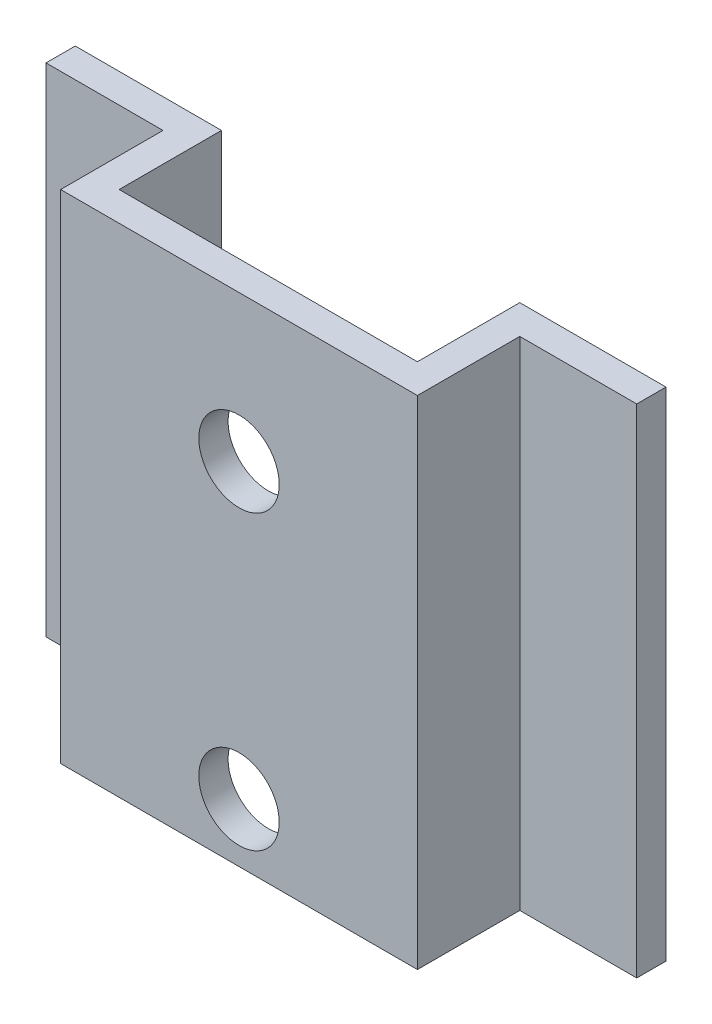
ISO-10303-21;
HEADER;
FILE_DESCRIPTION(('STEP AP214'),'2;1');
FILE_NAME('part.step','',(''),(''),'','','');
FILE_SCHEMA(('AUTOMOTIVE_DESIGN { 1 0 10303 214 1 1 1 1 }'));
ENDSEC;
DATA;
#1=APPLICATION_CONTEXT('core data for automotive mechanical design processes');
#2=APPLICATION_PROTOCOL_DEFINITION('international standard','automotive_design',2000,#1);
#3=PRODUCT_CONTEXT('',#1,'mechanical');
#4=PRODUCT('Part','Part','',(#3));
#5=PRODUCT_RELATED_PRODUCT_CATEGORY('part','',(#4));
#6=PRODUCT_DEFINITION_FORMATION('','',#4);
#7=PRODUCT_DEFINITION_CONTEXT('part definition',#1,'design');
#8=PRODUCT_DEFINITION('design','',#6,#7);
#9=PRODUCT_DEFINITION_SHAPE('','',#8);
#10=(LENGTH_UNIT() NAMED_UNIT(*) SI_UNIT(.MILLI.,.METRE.));
#11=(NAMED_UNIT(*) PLANE_ANGLE_UNIT() SI_UNIT($,.RADIAN.));
#12=(NAMED_UNIT(*) SI_UNIT($,.STERADIAN.) SOLID_ANGLE_UNIT());
#13=UNCERTAINTY_MEASURE_WITH_UNIT(LENGTH_MEASURE(1.E-05),#10,'distance_accuracy_value','');
#14=(GEOMETRIC_REPRESENTATION_CONTEXT(3) GLOBAL_UNCERTAINTY_ASSIGNED_CONTEXT((#13)) GLOBAL_UNIT_ASSIGNED_CONTEXT((#10,
#11,#12)) REPRESENTATION_CONTEXT('',''));
#15=CARTESIAN_POINT('',(0.,0.,0.));
#16=DIRECTION('',(0.,0.,1.));
#17=DIRECTION('',(1.,0.,0.));
#18=AXIS2_PLACEMENT_3D('',#15,#16,#17);
#19=CARTESIAN_POINT('',(0.,0.,2.));
#20=DIRECTION('',(0.,0.,1.));
#21=DIRECTION('',(1.,0.,0.));
#22=AXIS2_PLACEMENT_3D('',#19,#20,#21);
#23=PLANE('',#22);
#24=CARTESIAN_POINT('',(1.78676518025611E-13,52.0000000000006,2.));
#25=DIRECTION('',(0.,0.,-1.));
#26=DIRECTION('',(-1.,0.,0.));
#27=AXIS2_PLACEMENT_3D('',#24,#25,#26);
#28=CIRCLE('',#27,2.75);
#29=CARTESIAN_POINT('',(-2.74999999999982,52.0000000000006,2.));
#30=VERTEX_POINT('',#29);
#31=EDGE_CURVE('E167',#30,#30,#28,.T.);
#32=ORIENTED_EDGE('',*,*,#31,.T.);
#33=EDGE_LOOP('',(#32));
#34=FACE_BOUND('',#33,.T.);
#35=CARTESIAN_POINT('',(1.78676518025611E-13,32.0000000000006,2.));
#36=DIRECTION('',(0.,0.,-1.));
#37=DIRECTION('',(-1.,0.,0.));
#38=AXIS2_PLACEMENT_3D('',#35,#36,#37);
#39=CIRCLE('',#38,2.75);
#40=CARTESIAN_POINT('',(-2.74999999999982,32.0000000000006,2.));
#41=VERTEX_POINT('',#40);
#42=EDGE_CURVE('E279',#41,#41,#39,.T.);
#43=ORIENTED_EDGE('',*,*,#42,.T.);
#44=EDGE_LOOP('',(#43));
#45=FACE_BOUND('',#44,.T.);
#46=DIRECTION('',(0.,1.,0.));
#47=VECTOR('',#46,1.);
#48=CARTESIAN_POINT('',(12.2000000000002,28.0000000000007,2.));
#49=LINE('',#48,#47);
#50=CARTESIAN_POINT('',(12.2000000000002,28.0000000000007,2.));
#51=VERTEX_POINT('',#50);
#52=CARTESIAN_POINT('',(12.2000000000002,62.0000000000007,2.));
#53=VERTEX_POINT('',#52);
#54=EDGE_CURVE('E131',#51,#53,#49,.T.);
#55=ORIENTED_EDGE('',*,*,#54,.T.);
#56=DIRECTION('',(-1.,0.,0.));
#57=VECTOR('',#56,1.);
#58=CARTESIAN_POINT('',(10.0000000000002,62.0000000000007,2.));
#59=LINE('',#58,#57);
#60=CARTESIAN_POINT('',(-12.1999999999998,62.0000000000007,2.));
#61=VERTEX_POINT('',#60);
#62=EDGE_CURVE('E44',#53,#61,#59,.T.);
#63=ORIENTED_EDGE('',*,*,#62,.T.);
#64=DIRECTION('',(0.,1.,0.));
#65=VECTOR('',#64,1.);
#66=CARTESIAN_POINT('',(-12.1999999999998,28.0000000000007,2.));
#67=LINE('',#66,#65);
#68=CARTESIAN_POINT('',(-12.1999999999998,28.0000000000007,2.));
#69=VERTEX_POINT('',#68);
#70=EDGE_CURVE('E151',#69,#61,#67,.T.);
#71=ORIENTED_EDGE('',*,*,#70,.F.);
#72=DIRECTION('',(1.,0.,0.));
#73=VECTOR('',#72,1.);
#74=CARTESIAN_POINT('',(-9.99999999999982,28.0000000000006,2.));
#75=LINE('',#74,#73);
#76=EDGE_CURVE('E11',#69,#51,#75,.T.);
#77=ORIENTED_EDGE('',*,*,#76,.T.);
#78=EDGE_LOOP('',(#55,#63,#71,#77));
#79=FACE_BOUND('',#78,.T.);
#80=ADVANCED_FACE('F35',(#34,#45,#79),#23,.T.);
#81=CARTESIAN_POINT('',(0.,0.,0.));
#82=DIRECTION('',(0.,0.,1.));
#83=DIRECTION('',(1.,0.,0.));
#84=AXIS2_PLACEMENT_3D('',#81,#82,#83);
#85=PLANE('',#84);
#86=CARTESIAN_POINT('',(1.78676518025611E-13,52.0000000000006,0.));
#87=DIRECTION('',(0.,0.,-1.));
#88=DIRECTION('',(-1.,0.,0.));
#89=AXIS2_PLACEMENT_3D('',#86,#87,#88);
#90=CIRCLE('',#89,2.75);
#91=CARTESIAN_POINT('',(-2.74999999999982,52.0000000000006,0.));
#92=VERTEX_POINT('',#91);
#93=EDGE_CURVE('E281',#92,#92,#90,.T.);
#94=ORIENTED_EDGE('',*,*,#93,.F.);
#95=EDGE_LOOP('',(#94));
#96=FACE_BOUND('',#95,.T.);
#97=CARTESIAN_POINT('',(1.78676518025611E-13,32.0000000000006,0.));
#98=DIRECTION('',(0.,0.,-1.));
#99=DIRECTION('',(-1.,0.,0.));
#100=AXIS2_PLACEMENT_3D('',#97,#98,#99);
#101=CIRCLE('',#100,2.75);
#102=CARTESIAN_POINT('',(-2.74999999999982,32.0000000000006,0.));
#103=VERTEX_POINT('',#102);
#104=EDGE_CURVE('E148',#103,#103,#101,.T.);
#105=ORIENTED_EDGE('',*,*,#104,.F.);
#106=EDGE_LOOP('',(#105));
#107=FACE_BOUND('',#106,.T.);
#108=DIRECTION('',(-1.,0.,0.));
#109=VECTOR('',#108,1.);
#110=CARTESIAN_POINT('',(10.0000000000002,62.0000000000007,0.));
#111=LINE('',#110,#109);
#112=CARTESIAN_POINT('',(10.2000000000002,62.0000000000007,0.));
#113=VERTEX_POINT('',#112);
#114=CARTESIAN_POINT('',(-10.1999999999998,62.0000000000007,0.));
#115=VERTEX_POINT('',#114);
#116=EDGE_CURVE('E217',#113,#115,#111,.T.);
#117=ORIENTED_EDGE('',*,*,#116,.F.);
#118=DIRECTION('',(0.,1.,0.));
#119=VECTOR('',#118,1.);
#120=CARTESIAN_POINT('',(10.2000000000002,7.50219523949032,0.));
#121=LINE('',#120,#119);
#122=CARTESIAN_POINT('',(10.2000000000002,28.0000000000007,0.));
#123=VERTEX_POINT('',#122);
#124=EDGE_CURVE('E214',#123,#113,#121,.T.);
#125=ORIENTED_EDGE('',*,*,#124,.F.);
#126=DIRECTION('',(1.,0.,0.));
#127=VECTOR('',#126,1.);
#128=CARTESIAN_POINT('',(-9.99999999999982,28.0000000000006,0.));
#129=LINE('',#128,#127);
#130=CARTESIAN_POINT('',(-10.1999999999998,28.0000000000007,0.));
#131=VERTEX_POINT('',#130);
#132=EDGE_CURVE('E39',#131,#123,#129,.T.);
#133=ORIENTED_EDGE('',*,*,#132,.F.);
#134=DIRECTION('',(0.,1.,0.));
#135=VECTOR('',#134,1.);
#136=CARTESIAN_POINT('',(-10.1999999999998,7.50219523949032,0.));
#137=LINE('',#136,#135);
#138=EDGE_CURVE('E206',#131,#115,#137,.T.);
#139=ORIENTED_EDGE('',*,*,#138,.T.);
#140=EDGE_LOOP('',(#117,#125,#133,#139));
#141=FACE_BOUND('',#140,.T.);
#142=ADVANCED_FACE('F229',(#96,#107,#141),#85,.F.);
#143=CARTESIAN_POINT('',(10.0000000000002,62.0000000000007,2.));
#144=DIRECTION('',(0.,-1.,0.));
#145=DIRECTION('',(0.,0.,-1.));
#146=AXIS2_PLACEMENT_3D('',#143,#144,#145);
#147=PLANE('',#146);
#148=DIRECTION('',(0.,0.,1.));
#149=VECTOR('',#148,1.);
#150=CARTESIAN_POINT('',(12.2000000000002,62.0000000000007,0.));
#151=LINE('',#150,#149);
#152=CARTESIAN_POINT('',(12.2000000000002,62.0000000000007,-5.00000000000001));
#153=VERTEX_POINT('',#152);
#154=EDGE_CURVE('E144',#153,#53,#151,.T.);
#155=ORIENTED_EDGE('',*,*,#154,.F.);
#156=DIRECTION('',(-1.,0.,0.));
#157=VECTOR('',#156,1.);
#158=CARTESIAN_POINT('',(0.,62.0000000000007,-5.00000000000001));
#159=LINE('',#158,#157);
#160=CARTESIAN_POINT('',(20.2000000000002,62.0000000000007,-5.00000000000001));
#161=VERTEX_POINT('',#160);
#162=EDGE_CURVE('E128',#161,#153,#159,.T.);
#163=ORIENTED_EDGE('',*,*,#162,.F.);
#164=DIRECTION('',(0.,0.,-1.));
#165=VECTOR('',#164,1.);
#166=CARTESIAN_POINT('',(20.2000000000002,62.0000000000007,2.));
#167=LINE('',#166,#165);
#168=CARTESIAN_POINT('',(20.2000000000002,62.0000000000007,-7.00000000000001));
#169=VERTEX_POINT('',#168);
#170=EDGE_CURVE('E176',#161,#169,#167,.T.);
#171=ORIENTED_EDGE('',*,*,#170,.T.);
#172=DIRECTION('',(1.,0.,0.));
#173=VECTOR('',#172,1.);
#174=CARTESIAN_POINT('',(10.2000000000002,62.0000000000007,-7.00000000000001));
#175=LINE('',#174,#173);
#176=CARTESIAN_POINT('',(10.2000000000002,62.0000000000007,-7.00000000000001));
#177=VERTEX_POINT('',#176);
#178=EDGE_CURVE('E177',#177,#169,#175,.T.);
#179=ORIENTED_EDGE('',*,*,#178,.F.);
#180=DIRECTION('',(0.,0.,-1.));
#181=VECTOR('',#180,1.);
#182=CARTESIAN_POINT('',(10.2000000000002,62.0000000000007,2.));
#183=LINE('',#182,#181);
#184=EDGE_CURVE('E185',#113,#177,#183,.T.);
#185=ORIENTED_EDGE('',*,*,#184,.F.);
#186=ORIENTED_EDGE('',*,*,#116,.T.);
#187=DIRECTION('',(0.,0.,-1.));
#188=VECTOR('',#187,1.);
#189=CARTESIAN_POINT('',(-10.1999999999998,62.0000000000007,2.));
#190=LINE('',#189,#188);
#191=CARTESIAN_POINT('',(-10.1999999999998,62.0000000000007,-7.00000000000001));
#192=VERTEX_POINT('',#191);
#193=EDGE_CURVE('E209',#115,#192,#190,.T.);
#194=ORIENTED_EDGE('',*,*,#193,.T.);
#195=DIRECTION('',(1.,0.,0.));
#196=VECTOR('',#195,1.);
#197=CARTESIAN_POINT('',(-20.1999999999998,62.0000000000007,-7.00000000000001));
#198=LINE('',#197,#196);
#199=CARTESIAN_POINT('',(-20.1999999999998,62.0000000000007,-7.00000000000001));
#200=VERTEX_POINT('',#199);
#201=EDGE_CURVE('E192',#200,#192,#198,.T.);
#202=ORIENTED_EDGE('',*,*,#201,.F.);
#203=DIRECTION('',(0.,0.,-1.));
#204=VECTOR('',#203,1.);
#205=CARTESIAN_POINT('',(-20.1999999999998,62.0000000000007,2.));
#206=LINE('',#205,#204);
#207=CARTESIAN_POINT('',(-20.1999999999998,62.0000000000007,-5.00000000000001));
#208=VERTEX_POINT('',#207);
#209=EDGE_CURVE('E195',#208,#200,#206,.T.);
#210=ORIENTED_EDGE('',*,*,#209,.F.);
#211=DIRECTION('',(-1.,0.,0.));
#212=VECTOR('',#211,1.);
#213=CARTESIAN_POINT('',(0.,62.0000000000007,-5.00000000000001));
#214=LINE('',#213,#212);
#215=CARTESIAN_POINT('',(-12.1999999999998,62.0000000000007,-5.00000000000001));
#216=VERTEX_POINT('',#215);
#217=EDGE_CURVE('E52',#216,#208,#214,.T.);
#218=ORIENTED_EDGE('',*,*,#217,.F.);
#219=DIRECTION('',(0.,0.,-1.));
#220=VECTOR('',#219,1.);
#221=CARTESIAN_POINT('',(-12.1999999999998,62.0000000000007,0.));
#222=LINE('',#221,#220);
#223=EDGE_CURVE('E164',#61,#216,#222,.T.);
#224=ORIENTED_EDGE('',*,*,#223,.F.);
#225=ORIENTED_EDGE('',*,*,#62,.F.);
#226=EDGE_LOOP('',(#155,#163,#171,#179,#185,#186,#194,#202,#210,#218,#224,#225));
#227=FACE_BOUND('',#226,.T.);
#228=ADVANCED_FACE('F37',(#227),#147,.F.);
#229=CARTESIAN_POINT('',(-9.99999999999982,28.0000000000006,2.));
#230=DIRECTION('',(0.,1.,0.));
#231=DIRECTION('',(0.,0.,1.));
#232=AXIS2_PLACEMENT_3D('',#229,#230,#231);
#233=PLANE('',#232);
#234=DIRECTION('',(0.,0.,-1.));
#235=VECTOR('',#234,1.);
#236=CARTESIAN_POINT('',(20.2000000000002,28.0000000000007,2.));
#237=LINE('',#236,#235);
#238=CARTESIAN_POINT('',(20.2000000000002,28.0000000000007,-5.00000000000001));
#239=VERTEX_POINT('',#238);
#240=CARTESIAN_POINT('',(20.2000000000002,28.0000000000007,-7.00000000000001));
#241=VERTEX_POINT('',#240);
#242=EDGE_CURVE('E143',#239,#241,#237,.T.);
#243=ORIENTED_EDGE('',*,*,#242,.F.);
#244=DIRECTION('',(-1.,0.,0.));
#245=VECTOR('',#244,1.);
#246=CARTESIAN_POINT('',(0.,28.0000000000007,-5.00000000000001));
#247=LINE('',#246,#245);
#248=CARTESIAN_POINT('',(12.2000000000002,28.0000000000007,-5.00000000000001));
#249=VERTEX_POINT('',#248);
#250=EDGE_CURVE('E60',#239,#249,#247,.T.);
#251=ORIENTED_EDGE('',*,*,#250,.T.);
#252=DIRECTION('',(0.,0.,1.));
#253=VECTOR('',#252,1.);
#254=CARTESIAN_POINT('',(12.2000000000002,28.0000000000007,0.));
#255=LINE('',#254,#253);
#256=EDGE_CURVE('E132',#249,#51,#255,.T.);
#257=ORIENTED_EDGE('',*,*,#256,.T.);
#258=ORIENTED_EDGE('',*,*,#76,.F.);
#259=DIRECTION('',(0.,0.,-1.));
#260=VECTOR('',#259,1.);
#261=CARTESIAN_POINT('',(-12.1999999999998,28.0000000000007,0.));
#262=LINE('',#261,#260);
#263=CARTESIAN_POINT('',(-12.1999999999998,28.0000000000007,-5.00000000000001));
#264=VERTEX_POINT('',#263);
#265=EDGE_CURVE('E157',#69,#264,#262,.T.);
#266=ORIENTED_EDGE('',*,*,#265,.T.);
#267=DIRECTION('',(-1.,0.,0.));
#268=VECTOR('',#267,1.);
#269=CARTESIAN_POINT('',(0.,28.0000000000007,-5.00000000000001));
#270=LINE('',#269,#268);
#271=CARTESIAN_POINT('',(-20.1999999999998,28.0000000000007,-5.00000000000001));
#272=VERTEX_POINT('',#271);
#273=EDGE_CURVE('E160',#264,#272,#270,.T.);
#274=ORIENTED_EDGE('',*,*,#273,.T.);
#275=DIRECTION('',(0.,0.,-1.));
#276=VECTOR('',#275,1.);
#277=CARTESIAN_POINT('',(-20.1999999999998,28.0000000000007,2.));
#278=LINE('',#277,#276);
#279=CARTESIAN_POINT('',(-20.1999999999998,28.0000000000007,-7.00000000000001));
#280=VERTEX_POINT('',#279);
#281=EDGE_CURVE('E204',#272,#280,#278,.T.);
#282=ORIENTED_EDGE('',*,*,#281,.T.);
#283=DIRECTION('',(-1.,0.,0.));
#284=VECTOR('',#283,1.);
#285=CARTESIAN_POINT('',(-10.1999999999998,28.0000000000007,-7.00000000000001));
#286=LINE('',#285,#284);
#287=CARTESIAN_POINT('',(-10.1999999999998,28.0000000000007,-7.00000000000001));
#288=VERTEX_POINT('',#287);
#289=EDGE_CURVE('E199',#288,#280,#286,.T.);
#290=ORIENTED_EDGE('',*,*,#289,.F.);
#291=DIRECTION('',(0.,0.,-1.));
#292=VECTOR('',#291,1.);
#293=CARTESIAN_POINT('',(-10.1999999999998,28.0000000000007,2.));
#294=LINE('',#293,#292);
#295=EDGE_CURVE('E207',#131,#288,#294,.T.);
#296=ORIENTED_EDGE('',*,*,#295,.F.);
#297=ORIENTED_EDGE('',*,*,#132,.T.);
#298=DIRECTION('',(0.,0.,-1.));
#299=VECTOR('',#298,1.);
#300=CARTESIAN_POINT('',(10.2000000000002,28.0000000000007,2.));
#301=LINE('',#300,#299);
#302=CARTESIAN_POINT('',(10.2000000000002,28.0000000000007,-7.00000000000001));
#303=VERTEX_POINT('',#302);
#304=EDGE_CURVE('E188',#123,#303,#301,.T.);
#305=ORIENTED_EDGE('',*,*,#304,.T.);
#306=DIRECTION('',(-1.,0.,0.));
#307=VECTOR('',#306,1.);
#308=CARTESIAN_POINT('',(20.2000000000002,28.0000000000007,-7.00000000000001));
#309=LINE('',#308,#307);
#310=EDGE_CURVE('E155',#241,#303,#309,.T.);
#311=ORIENTED_EDGE('',*,*,#310,.F.);
#312=EDGE_LOOP('',(#243,#251,#257,#258,#266,#274,#282,#290,#296,#297,#305,#311));
#313=FACE_BOUND('',#312,.T.);
#314=ADVANCED_FACE('F141',(#313),#233,.F.);
#315=CARTESIAN_POINT('',(-10.1999999999998,0.,2.));
#316=DIRECTION('',(1.,0.,0.));
#317=DIRECTION('',(0.,0.,-1.));
#318=AXIS2_PLACEMENT_3D('',#315,#316,#317);
#319=PLANE('',#318);
#320=ORIENTED_EDGE('',*,*,#138,.F.);
#321=ORIENTED_EDGE('',*,*,#295,.T.);
#322=DIRECTION('',(0.,-1.,0.));
#323=VECTOR('',#322,1.);
#324=CARTESIAN_POINT('',(-10.1999999999998,62.0000000000007,-7.00000000000001));
#325=LINE('',#324,#323);
#326=EDGE_CURVE('E187',#192,#288,#325,.T.);
#327=ORIENTED_EDGE('',*,*,#326,.F.);
#328=ORIENTED_EDGE('',*,*,#193,.F.);
#329=EDGE_LOOP('',(#320,#321,#327,#328));
#330=FACE_BOUND('',#329,.T.);
#331=ADVANCED_FACE('F257',(#330),#319,.T.);
#332=CARTESIAN_POINT('',(-20.1999999999998,0.,2.));
#333=DIRECTION('',(1.,0.,0.));
#334=DIRECTION('',(0.,1.,0.));
#335=AXIS2_PLACEMENT_3D('',#332,#333,#334);
#336=PLANE('',#335);
#337=ORIENTED_EDGE('',*,*,#281,.F.);
#338=DIRECTION('',(0.,1.,0.));
#339=VECTOR('',#338,1.);
#340=CARTESIAN_POINT('',(-20.1999999999998,28.0000000000007,-5.00000000000001));
#341=LINE('',#340,#339);
#342=EDGE_CURVE('E170',#272,#208,#341,.T.);
#343=ORIENTED_EDGE('',*,*,#342,.T.);
#344=ORIENTED_EDGE('',*,*,#209,.T.);
#345=DIRECTION('',(0.,1.,0.));
#346=VECTOR('',#345,1.);
#347=CARTESIAN_POINT('',(-20.1999999999998,28.0000000000007,-7.00000000000001));
#348=LINE('',#347,#346);
#349=EDGE_CURVE('E196',#280,#200,#348,.T.);
#350=ORIENTED_EDGE('',*,*,#349,.F.);
#351=EDGE_LOOP('',(#337,#343,#344,#350));
#352=FACE_BOUND('',#351,.T.);
#353=ADVANCED_FACE('F250',(#352),#336,.F.);
#354=CARTESIAN_POINT('',(-59.6940625505222,62.0000000000007,-7.00000000000001));
#355=DIRECTION('',(0.,0.,-1.));
#356=DIRECTION('',(-1.,0.,0.));
#357=AXIS2_PLACEMENT_3D('',#354,#355,#356);
#358=PLANE('',#357);
#359=ORIENTED_EDGE('',*,*,#326,.T.);
#360=ORIENTED_EDGE('',*,*,#289,.T.);
#361=ORIENTED_EDGE('',*,*,#349,.T.);
#362=ORIENTED_EDGE('',*,*,#201,.T.);
#363=EDGE_LOOP('',(#359,#360,#361,#362));
#364=FACE_BOUND('',#363,.T.);
#365=ADVANCED_FACE('F255',(#364),#358,.T.);
#366=CARTESIAN_POINT('',(10.2000000000002,0.,2.));
#367=DIRECTION('',(1.,0.,0.));
#368=DIRECTION('',(0.,0.,-1.));
#369=AXIS2_PLACEMENT_3D('',#366,#367,#368);
#370=PLANE('',#369);
#371=ORIENTED_EDGE('',*,*,#304,.F.);
#372=ORIENTED_EDGE('',*,*,#124,.T.);
#373=ORIENTED_EDGE('',*,*,#184,.T.);
#374=DIRECTION('',(0.,1.,0.));
#375=VECTOR('',#374,1.);
#376=CARTESIAN_POINT('',(10.2000000000002,28.0000000000007,-7.00000000000001));
#377=LINE('',#376,#375);
#378=EDGE_CURVE('E180',#303,#177,#377,.T.);
#379=ORIENTED_EDGE('',*,*,#378,.F.);
#380=EDGE_LOOP('',(#371,#372,#373,#379));
#381=FACE_BOUND('',#380,.T.);
#382=ADVANCED_FACE('F231',(#381),#370,.F.);
#383=CARTESIAN_POINT('',(20.2000000000002,0.,2.));
#384=DIRECTION('',(1.,0.,0.));
#385=DIRECTION('',(0.,1.,0.));
#386=AXIS2_PLACEMENT_3D('',#383,#384,#385);
#387=PLANE('',#386);
#388=DIRECTION('',(0.,1.,0.));
#389=VECTOR('',#388,1.);
#390=CARTESIAN_POINT('',(20.2000000000002,28.0000000000007,-5.00000000000001));
#391=LINE('',#390,#389);
#392=EDGE_CURVE('E153',#239,#161,#391,.T.);
#393=ORIENTED_EDGE('',*,*,#392,.F.);
#394=ORIENTED_EDGE('',*,*,#242,.T.);
#395=DIRECTION('',(0.,-1.,0.));
#396=VECTOR('',#395,1.);
#397=CARTESIAN_POINT('',(20.2000000000002,62.0000000000007,-7.00000000000001));
#398=LINE('',#397,#396);
#399=EDGE_CURVE('E173',#169,#241,#398,.T.);
#400=ORIENTED_EDGE('',*,*,#399,.F.);
#401=ORIENTED_EDGE('',*,*,#170,.F.);
#402=EDGE_LOOP('',(#393,#394,#400,#401));
#403=FACE_BOUND('',#402,.T.);
#404=ADVANCED_FACE('F238',(#403),#387,.T.);
#405=CARTESIAN_POINT('',(-59.6940625505222,62.0000000000007,-7.00000000000001));
#406=DIRECTION('',(0.,0.,-1.));
#407=DIRECTION('',(-1.,0.,0.));
#408=AXIS2_PLACEMENT_3D('',#405,#406,#407);
#409=PLANE('',#408);
#410=ORIENTED_EDGE('',*,*,#310,.T.);
#411=ORIENTED_EDGE('',*,*,#378,.T.);
#412=ORIENTED_EDGE('',*,*,#178,.T.);
#413=ORIENTED_EDGE('',*,*,#399,.T.);
#414=EDGE_LOOP('',(#410,#411,#412,#413));
#415=FACE_BOUND('',#414,.T.);
#416=ADVANCED_FACE('F234',(#415),#409,.T.);
#417=CARTESIAN_POINT('',(0.,28.0000000000007,-5.00000000000001));
#418=DIRECTION('',(0.,0.,-1.));
#419=DIRECTION('',(-1.,0.,0.));
#420=AXIS2_PLACEMENT_3D('',#417,#418,#419);
#421=PLANE('',#420);
#422=ORIENTED_EDGE('',*,*,#162,.T.);
#423=DIRECTION('',(0.,1.,0.));
#424=VECTOR('',#423,1.);
#425=CARTESIAN_POINT('',(12.2000000000002,28.0000000000007,-5.00000000000001));
#426=LINE('',#425,#424);
#427=EDGE_CURVE('E124',#249,#153,#426,.T.);
#428=ORIENTED_EDGE('',*,*,#427,.F.);
#429=ORIENTED_EDGE('',*,*,#250,.F.);
#430=ORIENTED_EDGE('',*,*,#392,.T.);
#431=EDGE_LOOP('',(#422,#428,#429,#430));
#432=FACE_BOUND('',#431,.T.);
#433=ADVANCED_FACE('F126',(#432),#421,.F.);
#434=CARTESIAN_POINT('',(12.2000000000002,28.0000000000007,0.));
#435=DIRECTION('',(-1.,0.,0.));
#436=DIRECTION('',(0.,0.,1.));
#437=AXIS2_PLACEMENT_3D('',#434,#435,#436);
#438=PLANE('',#437);
#439=ORIENTED_EDGE('',*,*,#154,.T.);
#440=ORIENTED_EDGE('',*,*,#54,.F.);
#441=ORIENTED_EDGE('',*,*,#256,.F.);
#442=ORIENTED_EDGE('',*,*,#427,.T.);
#443=EDGE_LOOP('',(#439,#440,#441,#442));
#444=FACE_BOUND('',#443,.T.);
#445=ADVANCED_FACE('F135',(#444),#438,.F.);
#446=CARTESIAN_POINT('',(-12.1999999999998,28.0000000000007,0.));
#447=DIRECTION('',(1.,0.,0.));
#448=DIRECTION('',(0.,0.,-1.));
#449=AXIS2_PLACEMENT_3D('',#446,#447,#448);
#450=PLANE('',#449);
#451=ORIENTED_EDGE('',*,*,#223,.T.);
#452=DIRECTION('',(0.,1.,0.));
#453=VECTOR('',#452,1.);
#454=CARTESIAN_POINT('',(-12.1999999999998,28.0000000000007,-5.00000000000001));
#455=LINE('',#454,#453);
#456=EDGE_CURVE('E163',#264,#216,#455,.T.);
#457=ORIENTED_EDGE('',*,*,#456,.F.);
#458=ORIENTED_EDGE('',*,*,#265,.F.);
#459=ORIENTED_EDGE('',*,*,#70,.T.);
#460=EDGE_LOOP('',(#451,#457,#458,#459));
#461=FACE_BOUND('',#460,.T.);
#462=ADVANCED_FACE('F246',(#461),#450,.F.);
#463=CARTESIAN_POINT('',(0.,28.0000000000007,-5.00000000000001));
#464=DIRECTION('',(0.,0.,-1.));
#465=DIRECTION('',(-1.,0.,0.));
#466=AXIS2_PLACEMENT_3D('',#463,#464,#465);
#467=PLANE('',#466);
#468=ORIENTED_EDGE('',*,*,#217,.T.);
#469=ORIENTED_EDGE('',*,*,#342,.F.);
#470=ORIENTED_EDGE('',*,*,#273,.F.);
#471=ORIENTED_EDGE('',*,*,#456,.T.);
#472=EDGE_LOOP('',(#468,#469,#470,#471));
#473=FACE_BOUND('',#472,.T.);
#474=ADVANCED_FACE('F247',(#473),#467,.F.);
#475=CARTESIAN_POINT('',(1.78676518025611E-13,32.0000000000006,2.));
#476=DIRECTION('',(0.,0.,-1.));
#477=DIRECTION('',(-1.,0.,0.));
#478=AXIS2_PLACEMENT_3D('',#475,#476,#477);
#479=CYLINDRICAL_SURFACE('',#478,2.75);
#480=ORIENTED_EDGE('',*,*,#42,.F.);
#481=EDGE_LOOP('',(#480));
#482=FACE_BOUND('',#481,.T.);
#483=ORIENTED_EDGE('',*,*,#104,.T.);
#484=EDGE_LOOP('',(#483));
#485=FACE_BOUND('',#484,.T.);
#486=ADVANCED_FACE('F288',(#482,#485),#479,.F.);
#487=CARTESIAN_POINT('',(1.78676518025611E-13,52.0000000000006,2.));
#488=DIRECTION('',(0.,0.,-1.));
#489=DIRECTION('',(-1.,0.,0.));
#490=AXIS2_PLACEMENT_3D('',#487,#488,#489);
#491=CYLINDRICAL_SURFACE('',#490,2.75);
#492=ORIENTED_EDGE('',*,*,#31,.F.);
#493=EDGE_LOOP('',(#492));
#494=FACE_BOUND('',#493,.T.);
#495=ORIENTED_EDGE('',*,*,#93,.T.);
#496=EDGE_LOOP('',(#495));
#497=FACE_BOUND('',#496,.T.);
#498=ADVANCED_FACE('F291',(#494,#497),#491,.F.);
#499=CLOSED_SHELL('',(#80,#142,#228,#314,#331,#353,#365,#382,#404,#416,#433,#445,#462,#474,#486,#498));
#500=MANIFOLD_SOLID_BREP('B2',#499);
#501=ADVANCED_BREP_SHAPE_REPRESENTATION('',(#18,#500),#14);
#502=SHAPE_DEFINITION_REPRESENTATION(#9,#501);
ENDSEC;
END-ISO-10303-21;
